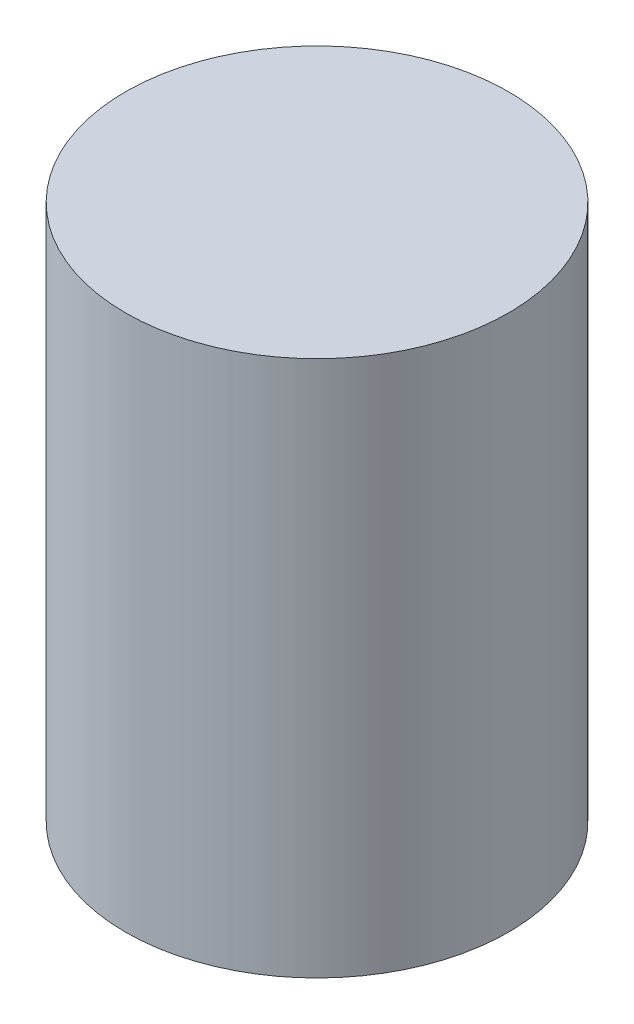
ISO-10303-21;
HEADER;
FILE_DESCRIPTION(('STEP AP214'),'2;1');
FILE_NAME('part.step','',(''),(''),'','','');
FILE_SCHEMA(('AUTOMOTIVE_DESIGN { 1 0 10303 214 1 1 1 1 }'));
ENDSEC;
DATA;
#1=APPLICATION_CONTEXT('core data for automotive mechanical design processes');
#2=APPLICATION_PROTOCOL_DEFINITION('international standard','automotive_design',2000,#1);
#3=PRODUCT_CONTEXT('',#1,'mechanical');
#4=PRODUCT('Part','Part','',(#3));
#5=PRODUCT_RELATED_PRODUCT_CATEGORY('part','',(#4));
#6=PRODUCT_DEFINITION_FORMATION('','',#4);
#7=PRODUCT_DEFINITION_CONTEXT('part definition',#1,'design');
#8=PRODUCT_DEFINITION('design','',#6,#7);
#9=PRODUCT_DEFINITION_SHAPE('','',#8);
#10=(LENGTH_UNIT() NAMED_UNIT(*) SI_UNIT(.MILLI.,.METRE.));
#11=(NAMED_UNIT(*) PLANE_ANGLE_UNIT() SI_UNIT($,.RADIAN.));
#12=(NAMED_UNIT(*) SI_UNIT($,.STERADIAN.) SOLID_ANGLE_UNIT());
#13=UNCERTAINTY_MEASURE_WITH_UNIT(LENGTH_MEASURE(1.E-05),#10,'distance_accuracy_value','');
#14=(GEOMETRIC_REPRESENTATION_CONTEXT(3) GLOBAL_UNCERTAINTY_ASSIGNED_CONTEXT((#13)) GLOBAL_UNIT_ASSIGNED_CONTEXT((#10,
#11,#12)) REPRESENTATION_CONTEXT('',''));
#15=CARTESIAN_POINT('',(0.,0.,0.));
#16=DIRECTION('',(0.,0.,1.));
#17=DIRECTION('',(1.,0.,0.));
#18=AXIS2_PLACEMENT_3D('',#15,#16,#17);
#19=CARTESIAN_POINT('',(150.,440.,-650.));
#20=DIRECTION('',(0.,-1.,0.));
#21=DIRECTION('',(0.,0.,-1.));
#22=AXIS2_PLACEMENT_3D('',#19,#20,#21);
#23=CYLINDRICAL_SURFACE('',#22,50.);
#24=CARTESIAN_POINT('',(150.,440.,-650.));
#25=DIRECTION('',(0.,1.,0.));
#26=DIRECTION('',(0.,0.,1.));
#27=AXIS2_PLACEMENT_3D('',#24,#25,#26);
#28=CIRCLE('',#27,50.);
#29=CARTESIAN_POINT('',(150.,440.,-600.));
#30=VERTEX_POINT('',#29);
#31=EDGE_CURVE('E10',#30,#30,#28,.T.);
#32=ORIENTED_EDGE('',*,*,#31,.F.);
#33=EDGE_LOOP('',(#32));
#34=FACE_BOUND('',#33,.T.);
#35=CARTESIAN_POINT('',(150.,300.,-650.));
#36=DIRECTION('',(0.,1.,0.));
#37=DIRECTION('',(0.,0.,1.));
#38=AXIS2_PLACEMENT_3D('',#35,#36,#37);
#39=CIRCLE('',#38,50.);
#40=CARTESIAN_POINT('',(150.,300.,-600.));
#41=VERTEX_POINT('',#40);
#42=EDGE_CURVE('E40',#41,#41,#39,.T.);
#43=ORIENTED_EDGE('',*,*,#42,.T.);
#44=EDGE_LOOP('',(#43));
#45=FACE_BOUND('',#44,.T.);
#46=ADVANCED_FACE('F37',(#34,#45),#23,.T.);
#47=CARTESIAN_POINT('',(150.,440.,-650.));
#48=DIRECTION('',(0.,1.,0.));
#49=DIRECTION('',(0.,0.,1.));
#50=AXIS2_PLACEMENT_3D('',#47,#48,#49);
#51=PLANE('',#50);
#52=ORIENTED_EDGE('',*,*,#31,.T.);
#53=EDGE_LOOP('',(#52));
#54=FACE_BOUND('',#53,.T.);
#55=ADVANCED_FACE('F52',(#54),#51,.T.);
#56=CARTESIAN_POINT('',(150.,300.,-650.));
#57=DIRECTION('',(0.,1.,0.));
#58=DIRECTION('',(0.,0.,1.));
#59=AXIS2_PLACEMENT_3D('',#56,#57,#58);
#60=PLANE('',#59);
#61=ORIENTED_EDGE('',*,*,#42,.F.);
#62=EDGE_LOOP('',(#61));
#63=FACE_BOUND('',#62,.T.);
#64=ADVANCED_FACE('F50',(#63),#60,.F.);
#65=CLOSED_SHELL('',(#46,#55,#64));
#66=MANIFOLD_SOLID_BREP('B2',#65);
#67=ADVANCED_BREP_SHAPE_REPRESENTATION('',(#18,#66),#14);
#68=SHAPE_DEFINITION_REPRESENTATION(#9,#67);
ENDSEC;
END-ISO-10303-21;
